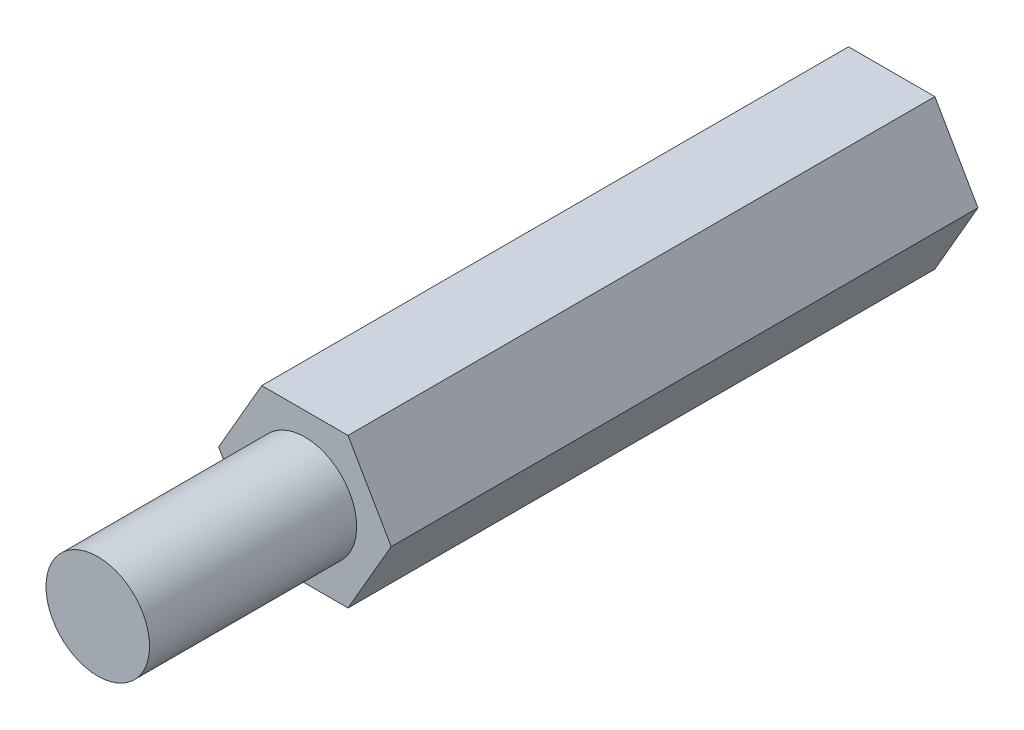
ISO-10303-21;
HEADER;
FILE_DESCRIPTION(('STEP AP214'),'2;1');
FILE_NAME('part.step','',(''),(''),'','','');
FILE_SCHEMA(('AUTOMOTIVE_DESIGN { 1 0 10303 214 1 1 1 1 }'));
ENDSEC;
DATA;
#1=APPLICATION_CONTEXT('core data for automotive mechanical design processes');
#2=APPLICATION_PROTOCOL_DEFINITION('international standard','automotive_design',2000,#1);
#3=PRODUCT_CONTEXT('',#1,'mechanical');
#4=PRODUCT('Part','Part','',(#3));
#5=PRODUCT_RELATED_PRODUCT_CATEGORY('part','',(#4));
#6=PRODUCT_DEFINITION_FORMATION('','',#4);
#7=PRODUCT_DEFINITION_CONTEXT('part definition',#1,'design');
#8=PRODUCT_DEFINITION('design','',#6,#7);
#9=PRODUCT_DEFINITION_SHAPE('','',#8);
#10=(LENGTH_UNIT() NAMED_UNIT(*) SI_UNIT(.MILLI.,.METRE.));
#11=(NAMED_UNIT(*) PLANE_ANGLE_UNIT() SI_UNIT($,.RADIAN.));
#12=(NAMED_UNIT(*) SI_UNIT($,.STERADIAN.) SOLID_ANGLE_UNIT());
#13=UNCERTAINTY_MEASURE_WITH_UNIT(LENGTH_MEASURE(1.E-05),#10,'distance_accuracy_value','');
#14=(GEOMETRIC_REPRESENTATION_CONTEXT(3) GLOBAL_UNCERTAINTY_ASSIGNED_CONTEXT((#13)) GLOBAL_UNIT_ASSIGNED_CONTEXT((#10,
#11,#12)) REPRESENTATION_CONTEXT('',''));
#15=CARTESIAN_POINT('',(0.,0.,0.));
#16=DIRECTION('',(0.,0.,1.));
#17=DIRECTION('',(1.,0.,0.));
#18=AXIS2_PLACEMENT_3D('',#15,#16,#17);
#19=CARTESIAN_POINT('',(0.,0.,17.));
#20=DIRECTION('',(0.,0.,-1.));
#21=DIRECTION('',(-1.,0.,0.));
#22=AXIS2_PLACEMENT_3D('',#19,#20,#21);
#23=PLANE('',#22);
#24=DIRECTION('',(-0.5,-0.866025403784439,0.));
#25=VECTOR('',#24,1.);
#26=CARTESIAN_POINT('',(-1.25,-2.1650635094611,17.));
#27=LINE('',#26,#25);
#28=CARTESIAN_POINT('',(0.,0.,17.));
#29=VERTEX_POINT('',#28);
#30=CARTESIAN_POINT('',(-1.25,-2.1650635094611,17.));
#31=VERTEX_POINT('',#30);
#32=EDGE_CURVE('E138',#29,#31,#27,.T.);
#33=ORIENTED_EDGE('',*,*,#32,.T.);
#34=DIRECTION('',(0.5,-0.866025403784439,0.));
#35=VECTOR('',#34,1.);
#36=CARTESIAN_POINT('',(0.,-4.33012701892219,17.));
#37=LINE('',#36,#35);
#38=CARTESIAN_POINT('',(0.,-4.33012701892219,17.));
#39=VERTEX_POINT('',#38);
#40=EDGE_CURVE('E96',#31,#39,#37,.T.);
#41=ORIENTED_EDGE('',*,*,#40,.T.);
#42=DIRECTION('',(1.,0.,0.));
#43=VECTOR('',#42,1.);
#44=CARTESIAN_POINT('',(2.5,-4.33012701892219,17.));
#45=LINE('',#44,#43);
#46=CARTESIAN_POINT('',(2.5,-4.33012701892219,17.));
#47=VERTEX_POINT('',#46);
#48=EDGE_CURVE('E109',#39,#47,#45,.T.);
#49=ORIENTED_EDGE('',*,*,#48,.T.);
#50=DIRECTION('',(0.5,0.866025403784439,0.));
#51=VECTOR('',#50,1.);
#52=CARTESIAN_POINT('',(3.75,-2.1650635094611,17.));
#53=LINE('',#52,#51);
#54=CARTESIAN_POINT('',(3.75,-2.1650635094611,17.));
#55=VERTEX_POINT('',#54);
#56=EDGE_CURVE('E103',#47,#55,#53,.T.);
#57=ORIENTED_EDGE('',*,*,#56,.T.);
#58=DIRECTION('',(-0.5,0.866025403784439,0.));
#59=VECTOR('',#58,1.);
#60=CARTESIAN_POINT('',(2.5,0.,17.));
#61=LINE('',#60,#59);
#62=CARTESIAN_POINT('',(2.5,0.,17.));
#63=VERTEX_POINT('',#62);
#64=EDGE_CURVE('E107',#55,#63,#61,.T.);
#65=ORIENTED_EDGE('',*,*,#64,.T.);
#66=DIRECTION('',(-1.,0.,0.));
#67=VECTOR('',#66,1.);
#68=CARTESIAN_POINT('',(0.,0.,17.));
#69=LINE('',#68,#67);
#70=EDGE_CURVE('E58',#63,#29,#69,.T.);
#71=ORIENTED_EDGE('',*,*,#70,.T.);
#72=EDGE_LOOP('',(#33,#41,#49,#57,#65,#71));
#73=FACE_BOUND('',#72,.T.);
#74=CARTESIAN_POINT('',(1.25,-2.1650635094611,17.));
#75=DIRECTION('',(0.,0.,-1.));
#76=DIRECTION('',(-1.,0.,0.));
#77=AXIS2_PLACEMENT_3D('',#74,#75,#76);
#78=CIRCLE('',#77,1.5);
#79=CARTESIAN_POINT('',(-0.25,-2.1650635094611,17.));
#80=VERTEX_POINT('',#79);
#81=EDGE_CURVE('E11',#80,#80,#78,.F.);
#82=ORIENTED_EDGE('',*,*,#81,.F.);
#83=EDGE_LOOP('',(#82));
#84=FACE_BOUND('',#83,.T.);
#85=ADVANCED_FACE('F41',(#73,#84),#23,.F.);
#86=CARTESIAN_POINT('',(-1.25,-2.1650635094611,17.));
#87=DIRECTION('',(0.866025403784439,-0.5,0.));
#88=DIRECTION('',(0.5,0.866025403784439,0.));
#89=AXIS2_PLACEMENT_3D('',#86,#87,#88);
#90=PLANE('',#89);
#91=DIRECTION('',(-0.5,-0.866025403784439,0.));
#92=VECTOR('',#91,1.);
#93=CARTESIAN_POINT('',(-1.25,-2.1650635094611,0.));
#94=LINE('',#93,#92);
#95=CARTESIAN_POINT('',(0.,0.,0.));
#96=VERTEX_POINT('',#95);
#97=CARTESIAN_POINT('',(-1.25,-2.1650635094611,0.));
#98=VERTEX_POINT('',#97);
#99=EDGE_CURVE('E127',#96,#98,#94,.T.);
#100=ORIENTED_EDGE('',*,*,#99,.T.);
#101=DIRECTION('',(0.,0.,-1.));
#102=VECTOR('',#101,1.);
#103=CARTESIAN_POINT('',(-1.25,-2.1650635094611,17.));
#104=LINE('',#103,#102);
#105=EDGE_CURVE('E50',#31,#98,#104,.T.);
#106=ORIENTED_EDGE('',*,*,#105,.F.);
#107=ORIENTED_EDGE('',*,*,#32,.F.);
#108=DIRECTION('',(0.,0.,-1.));
#109=VECTOR('',#108,1.);
#110=CARTESIAN_POINT('',(0.,0.,17.));
#111=LINE('',#110,#109);
#112=EDGE_CURVE('E123',#29,#96,#111,.T.);
#113=ORIENTED_EDGE('',*,*,#112,.T.);
#114=EDGE_LOOP('',(#100,#106,#107,#113));
#115=FACE_BOUND('',#114,.T.);
#116=ADVANCED_FACE('F43',(#115),#90,.F.);
#117=CARTESIAN_POINT('',(0.,-4.33012701892219,17.));
#118=DIRECTION('',(0.866025403784439,0.5,0.));
#119=DIRECTION('',(-0.5,0.866025403784439,0.));
#120=AXIS2_PLACEMENT_3D('',#117,#118,#119);
#121=PLANE('',#120);
#122=DIRECTION('',(0.5,-0.866025403784439,0.));
#123=VECTOR('',#122,1.);
#124=CARTESIAN_POINT('',(0.,-4.33012701892219,0.));
#125=LINE('',#124,#123);
#126=CARTESIAN_POINT('',(0.,-4.33012701892219,0.));
#127=VERTEX_POINT('',#126);
#128=EDGE_CURVE('E130',#98,#127,#125,.T.);
#129=ORIENTED_EDGE('',*,*,#128,.T.);
#130=DIRECTION('',(0.,0.,-1.));
#131=VECTOR('',#130,1.);
#132=CARTESIAN_POINT('',(0.,-4.33012701892219,17.));
#133=LINE('',#132,#131);
#134=EDGE_CURVE('E142',#39,#127,#133,.T.);
#135=ORIENTED_EDGE('',*,*,#134,.F.);
#136=ORIENTED_EDGE('',*,*,#40,.F.);
#137=ORIENTED_EDGE('',*,*,#105,.T.);
#138=EDGE_LOOP('',(#129,#135,#136,#137));
#139=FACE_BOUND('',#138,.T.);
#140=ADVANCED_FACE('F145',(#139),#121,.F.);
#141=CARTESIAN_POINT('',(2.5,-4.33012701892219,17.));
#142=DIRECTION('',(0.,1.,0.));
#143=DIRECTION('',(0.,0.,1.));
#144=AXIS2_PLACEMENT_3D('',#141,#142,#143);
#145=PLANE('',#144);
#146=DIRECTION('',(1.,0.,0.));
#147=VECTOR('',#146,1.);
#148=CARTESIAN_POINT('',(2.5,-4.33012701892219,0.));
#149=LINE('',#148,#147);
#150=CARTESIAN_POINT('',(2.5,-4.33012701892219,0.));
#151=VERTEX_POINT('',#150);
#152=EDGE_CURVE('E133',#127,#151,#149,.T.);
#153=ORIENTED_EDGE('',*,*,#152,.T.);
#154=DIRECTION('',(0.,0.,-1.));
#155=VECTOR('',#154,1.);
#156=CARTESIAN_POINT('',(2.5,-4.33012701892219,17.));
#157=LINE('',#156,#155);
#158=EDGE_CURVE('E118',#47,#151,#157,.T.);
#159=ORIENTED_EDGE('',*,*,#158,.F.);
#160=ORIENTED_EDGE('',*,*,#48,.F.);
#161=ORIENTED_EDGE('',*,*,#134,.T.);
#162=EDGE_LOOP('',(#153,#159,#160,#161));
#163=FACE_BOUND('',#162,.T.);
#164=ADVANCED_FACE('F153',(#163),#145,.F.);
#165=CARTESIAN_POINT('',(3.75,-2.1650635094611,17.));
#166=DIRECTION('',(-0.866025403784439,0.5,0.));
#167=DIRECTION('',(-0.5,-0.866025403784439,0.));
#168=AXIS2_PLACEMENT_3D('',#165,#166,#167);
#169=PLANE('',#168);
#170=DIRECTION('',(0.5,0.866025403784439,0.));
#171=VECTOR('',#170,1.);
#172=CARTESIAN_POINT('',(3.75,-2.1650635094611,0.));
#173=LINE('',#172,#171);
#174=CARTESIAN_POINT('',(3.75,-2.1650635094611,0.));
#175=VERTEX_POINT('',#174);
#176=EDGE_CURVE('E117',#151,#175,#173,.T.);
#177=ORIENTED_EDGE('',*,*,#176,.T.);
#178=DIRECTION('',(0.,0.,-1.));
#179=VECTOR('',#178,1.);
#180=CARTESIAN_POINT('',(3.75,-2.1650635094611,17.));
#181=LINE('',#180,#179);
#182=EDGE_CURVE('E114',#55,#175,#181,.T.);
#183=ORIENTED_EDGE('',*,*,#182,.F.);
#184=ORIENTED_EDGE('',*,*,#56,.F.);
#185=ORIENTED_EDGE('',*,*,#158,.T.);
#186=EDGE_LOOP('',(#177,#183,#184,#185));
#187=FACE_BOUND('',#186,.T.);
#188=ADVANCED_FACE('F115',(#187),#169,.F.);
#189=CARTESIAN_POINT('',(2.5,0.,17.));
#190=DIRECTION('',(-0.866025403784439,-0.5,0.));
#191=DIRECTION('',(0.5,-0.866025403784439,0.));
#192=AXIS2_PLACEMENT_3D('',#189,#190,#191);
#193=PLANE('',#192);
#194=DIRECTION('',(-0.5,0.866025403784439,0.));
#195=VECTOR('',#194,1.);
#196=CARTESIAN_POINT('',(2.5,0.,0.));
#197=LINE('',#196,#195);
#198=CARTESIAN_POINT('',(2.5,0.,0.));
#199=VERTEX_POINT('',#198);
#200=EDGE_CURVE('E81',#175,#199,#197,.T.);
#201=ORIENTED_EDGE('',*,*,#200,.T.);
#202=DIRECTION('',(0.,0.,-1.));
#203=VECTOR('',#202,1.);
#204=CARTESIAN_POINT('',(2.5,0.,17.));
#205=LINE('',#204,#203);
#206=EDGE_CURVE('E119',#63,#199,#205,.T.);
#207=ORIENTED_EDGE('',*,*,#206,.F.);
#208=ORIENTED_EDGE('',*,*,#64,.F.);
#209=ORIENTED_EDGE('',*,*,#182,.T.);
#210=EDGE_LOOP('',(#201,#207,#208,#209));
#211=FACE_BOUND('',#210,.T.);
#212=ADVANCED_FACE('F121',(#211),#193,.F.);
#213=CARTESIAN_POINT('',(0.,0.,17.));
#214=DIRECTION('',(0.,-1.,0.));
#215=DIRECTION('',(0.,0.,-1.));
#216=AXIS2_PLACEMENT_3D('',#213,#214,#215);
#217=PLANE('',#216);
#218=DIRECTION('',(-1.,0.,0.));
#219=VECTOR('',#218,1.);
#220=CARTESIAN_POINT('',(0.,0.,0.));
#221=LINE('',#220,#219);
#222=EDGE_CURVE('E87',#199,#96,#221,.T.);
#223=ORIENTED_EDGE('',*,*,#222,.T.);
#224=ORIENTED_EDGE('',*,*,#112,.F.);
#225=ORIENTED_EDGE('',*,*,#70,.F.);
#226=ORIENTED_EDGE('',*,*,#206,.T.);
#227=EDGE_LOOP('',(#223,#224,#225,#226));
#228=FACE_BOUND('',#227,.T.);
#229=ADVANCED_FACE('F186',(#228),#217,.F.);
#230=CARTESIAN_POINT('',(0.,0.,0.));
#231=DIRECTION('',(0.,0.,-1.));
#232=DIRECTION('',(-1.,0.,0.));
#233=AXIS2_PLACEMENT_3D('',#230,#231,#232);
#234=PLANE('',#233);
#235=CARTESIAN_POINT('',(1.25,-2.1650635094611,0.));
#236=DIRECTION('',(0.,0.,1.));
#237=DIRECTION('',(1.,0.,0.));
#238=AXIS2_PLACEMENT_3D('',#235,#236,#237);
#239=CIRCLE('',#238,1.25);
#240=CARTESIAN_POINT('',(2.5,-2.1650635094611,0.));
#241=VERTEX_POINT('',#240);
#242=EDGE_CURVE('E131',#241,#241,#239,.T.);
#243=ORIENTED_EDGE('',*,*,#242,.T.);
#244=EDGE_LOOP('',(#243));
#245=FACE_BOUND('',#244,.T.);
#246=ORIENTED_EDGE('',*,*,#99,.F.);
#247=ORIENTED_EDGE('',*,*,#222,.F.);
#248=ORIENTED_EDGE('',*,*,#200,.F.);
#249=ORIENTED_EDGE('',*,*,#176,.F.);
#250=ORIENTED_EDGE('',*,*,#152,.F.);
#251=ORIENTED_EDGE('',*,*,#128,.F.);
#252=EDGE_LOOP('',(#246,#247,#248,#249,#250,#251));
#253=FACE_BOUND('',#252,.T.);
#254=ADVANCED_FACE('F150',(#245,#253),#234,.T.);
#255=CARTESIAN_POINT('',(1.25,-2.1650635094611,17.));
#256=DIRECTION('',(0.,0.,1.));
#257=DIRECTION('',(1.,0.,0.));
#258=AXIS2_PLACEMENT_3D('',#255,#256,#257);
#259=CYLINDRICAL_SURFACE('',#258,1.24999999999999);
#260=ORIENTED_EDGE('',*,*,#242,.F.);
#261=EDGE_LOOP('',(#260));
#262=FACE_BOUND('',#261,.T.);
#263=CARTESIAN_POINT('',(1.25,-2.1650635094611,17.));
#264=DIRECTION('',(0.,0.,1.));
#265=DIRECTION('',(1.,0.,0.));
#266=AXIS2_PLACEMENT_3D('',#263,#264,#265);
#267=CIRCLE('',#266,1.24999999999999);
#268=CARTESIAN_POINT('',(2.49999999999999,-2.1650635094611,17.));
#269=VERTEX_POINT('',#268);
#270=EDGE_CURVE('E159',#269,#269,#267,.F.);
#271=ORIENTED_EDGE('',*,*,#270,.F.);
#272=EDGE_LOOP('',(#271));
#273=FACE_BOUND('',#272,.T.);
#274=ADVANCED_FACE('F183',(#262,#273),#259,.F.);
#275=CARTESIAN_POINT('',(1.25,-2.1650635094611,17.));
#276=DIRECTION('',(0.,0.,1.));
#277=DIRECTION('',(1.,0.,0.));
#278=AXIS2_PLACEMENT_3D('',#275,#276,#277);
#279=PLANE('',#278);
#280=ORIENTED_EDGE('',*,*,#270,.T.);
#281=EDGE_LOOP('',(#280));
#282=FACE_BOUND('',#281,.T.);
#283=ADVANCED_FACE('F171',(#282),#279,.F.);
#284=CARTESIAN_POINT('',(1.25,-2.1650635094611,23.));
#285=DIRECTION('',(0.,0.,-1.));
#286=DIRECTION('',(-1.,0.,0.));
#287=AXIS2_PLACEMENT_3D('',#284,#285,#286);
#288=CYLINDRICAL_SURFACE('',#287,1.5);
#289=CARTESIAN_POINT('',(1.25,-2.1650635094611,23.));
#290=DIRECTION('',(0.,0.,1.));
#291=DIRECTION('',(1.,0.,0.));
#292=AXIS2_PLACEMENT_3D('',#289,#290,#291);
#293=CIRCLE('',#292,1.5);
#294=CARTESIAN_POINT('',(2.75,-2.1650635094611,23.));
#295=VERTEX_POINT('',#294);
#296=EDGE_CURVE('E162',#295,#295,#293,.T.);
#297=ORIENTED_EDGE('',*,*,#296,.F.);
#298=EDGE_LOOP('',(#297));
#299=FACE_BOUND('',#298,.T.);
#300=ORIENTED_EDGE('',*,*,#81,.T.);
#301=EDGE_LOOP('',(#300));
#302=FACE_BOUND('',#301,.T.);
#303=ADVANCED_FACE('F168',(#299,#302),#288,.T.);
#304=CARTESIAN_POINT('',(1.25,-2.1650635094611,23.));
#305=DIRECTION('',(0.,0.,1.));
#306=DIRECTION('',(1.,0.,0.));
#307=AXIS2_PLACEMENT_3D('',#304,#305,#306);
#308=PLANE('',#307);
#309=ORIENTED_EDGE('',*,*,#296,.T.);
#310=EDGE_LOOP('',(#309));
#311=FACE_BOUND('',#310,.T.);
#312=ADVANCED_FACE('F166',(#311),#308,.T.);
#313=CLOSED_SHELL('',(#85,#116,#140,#164,#188,#212,#229,#254,#274,#283,#303,#312));
#314=MANIFOLD_SOLID_BREP('B2',#313);
#315=ADVANCED_BREP_SHAPE_REPRESENTATION('',(#18,#314),#14);
#316=SHAPE_DEFINITION_REPRESENTATION(#9,#315);
ENDSEC;
END-ISO-10303-21;
